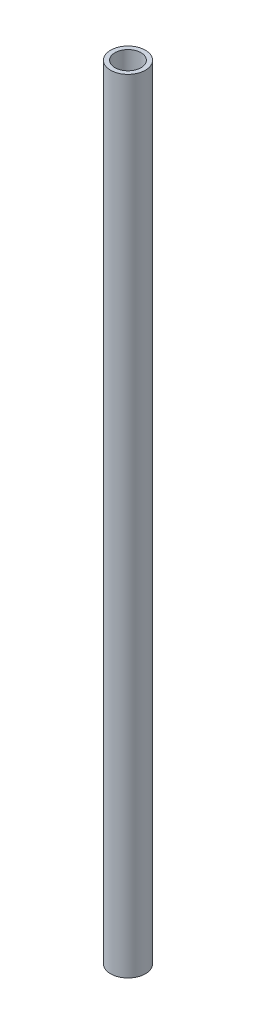
ISO-10303-21;
HEADER;
FILE_DESCRIPTION(('STEP AP214'),'2;1');
FILE_NAME('part.step','',(''),(''),'','','');
FILE_SCHEMA(('AUTOMOTIVE_DESIGN { 1 0 10303 214 1 1 1 1 }'));
ENDSEC;
DATA;
#1=APPLICATION_CONTEXT('core data for automotive mechanical design processes');
#2=APPLICATION_PROTOCOL_DEFINITION('international standard','automotive_design',2000,#1);
#3=PRODUCT_CONTEXT('',#1,'mechanical');
#4=PRODUCT('Part','Part','',(#3));
#5=PRODUCT_RELATED_PRODUCT_CATEGORY('part','',(#4));
#6=PRODUCT_DEFINITION_FORMATION('','',#4);
#7=PRODUCT_DEFINITION_CONTEXT('part definition',#1,'design');
#8=PRODUCT_DEFINITION('design','',#6,#7);
#9=PRODUCT_DEFINITION_SHAPE('','',#8);
#10=(LENGTH_UNIT() NAMED_UNIT(*) SI_UNIT(.MILLI.,.METRE.));
#11=(NAMED_UNIT(*) PLANE_ANGLE_UNIT() SI_UNIT($,.RADIAN.));
#12=(NAMED_UNIT(*) SI_UNIT($,.STERADIAN.) SOLID_ANGLE_UNIT());
#13=UNCERTAINTY_MEASURE_WITH_UNIT(LENGTH_MEASURE(1.E-05),#10,'distance_accuracy_value','');
#14=(GEOMETRIC_REPRESENTATION_CONTEXT(3) GLOBAL_UNCERTAINTY_ASSIGNED_CONTEXT((#13)) GLOBAL_UNIT_ASSIGNED_CONTEXT((#10,
#11,#12)) REPRESENTATION_CONTEXT('',''));
#15=CARTESIAN_POINT('',(0.,0.,0.));
#16=DIRECTION('',(0.,0.,1.));
#17=DIRECTION('',(1.,0.,0.));
#18=AXIS2_PLACEMENT_3D('',#15,#16,#17);
#19=CARTESIAN_POINT('',(0.,0.,0.));
#20=DIRECTION('',(0.,1.,0.));
#21=DIRECTION('',(0.,0.,1.));
#22=AXIS2_PLACEMENT_3D('',#19,#20,#21);
#23=CYLINDRICAL_SURFACE('',#22,4.);
#24=CARTESIAN_POINT('',(0.,180.,0.));
#25=DIRECTION('',(0.,1.,0.));
#26=DIRECTION('',(0.,0.,1.));
#27=AXIS2_PLACEMENT_3D('',#24,#25,#26);
#28=CIRCLE('',#27,4.);
#29=CARTESIAN_POINT('',(0.,180.,4.));
#30=VERTEX_POINT('',#29);
#31=EDGE_CURVE('E60',#30,#30,#28,.T.);
#32=ORIENTED_EDGE('',*,*,#31,.F.);
#33=EDGE_LOOP('',(#32));
#34=FACE_BOUND('',#33,.T.);
#35=CARTESIAN_POINT('',(0.,0.,0.));
#36=DIRECTION('',(0.,1.,0.));
#37=DIRECTION('',(0.,0.,1.));
#38=AXIS2_PLACEMENT_3D('',#35,#36,#37);
#39=CIRCLE('',#38,4.);
#40=CARTESIAN_POINT('',(0.,0.,4.));
#41=VERTEX_POINT('',#40);
#42=EDGE_CURVE('E45',#41,#41,#39,.T.);
#43=ORIENTED_EDGE('',*,*,#42,.T.);
#44=EDGE_LOOP('',(#43));
#45=FACE_BOUND('',#44,.T.);
#46=ADVANCED_FACE('F42',(#34,#45),#23,.T.);
#47=CARTESIAN_POINT('',(0.,0.,0.));
#48=DIRECTION('',(0.,1.,0.));
#49=DIRECTION('',(0.,0.,1.));
#50=AXIS2_PLACEMENT_3D('',#47,#48,#49);
#51=PLANE('',#50);
#52=CARTESIAN_POINT('',(0.,0.,0.));
#53=DIRECTION('',(0.,1.,0.));
#54=DIRECTION('',(0.,0.,1.));
#55=AXIS2_PLACEMENT_3D('',#52,#53,#54);
#56=CIRCLE('',#55,3.);
#57=CARTESIAN_POINT('',(0.,0.,3.));
#58=VERTEX_POINT('',#57);
#59=EDGE_CURVE('E50',#58,#58,#56,.F.);
#60=ORIENTED_EDGE('',*,*,#59,.F.);
#61=EDGE_LOOP('',(#60));
#62=FACE_BOUND('',#61,.T.);
#63=ORIENTED_EDGE('',*,*,#42,.F.);
#64=EDGE_LOOP('',(#63));
#65=FACE_BOUND('',#64,.T.);
#66=ADVANCED_FACE('F78',(#62,#65),#51,.F.);
#67=CARTESIAN_POINT('',(0.,180.,0.));
#68=DIRECTION('',(0.,1.,0.));
#69=DIRECTION('',(0.,0.,1.));
#70=AXIS2_PLACEMENT_3D('',#67,#68,#69);
#71=PLANE('',#70);
#72=CARTESIAN_POINT('',(0.,180.,0.));
#73=DIRECTION('',(0.,1.,0.));
#74=DIRECTION('',(0.,0.,1.));
#75=AXIS2_PLACEMENT_3D('',#72,#73,#74);
#76=CIRCLE('',#75,3.);
#77=CARTESIAN_POINT('',(0.,180.,3.));
#78=VERTEX_POINT('',#77);
#79=EDGE_CURVE('E13',#78,#78,#76,.F.);
#80=ORIENTED_EDGE('',*,*,#79,.T.);
#81=EDGE_LOOP('',(#80));
#82=FACE_BOUND('',#81,.T.);
#83=ORIENTED_EDGE('',*,*,#31,.T.);
#84=EDGE_LOOP('',(#83));
#85=FACE_BOUND('',#84,.T.);
#86=ADVANCED_FACE('F67',(#82,#85),#71,.T.);
#87=CARTESIAN_POINT('',(0.,0.,0.));
#88=DIRECTION('',(0.,1.,0.));
#89=DIRECTION('',(0.,0.,1.));
#90=AXIS2_PLACEMENT_3D('',#87,#88,#89);
#91=CYLINDRICAL_SURFACE('',#90,3.);
#92=ORIENTED_EDGE('',*,*,#79,.F.);
#93=EDGE_LOOP('',(#92));
#94=FACE_BOUND('',#93,.T.);
#95=ORIENTED_EDGE('',*,*,#59,.T.);
#96=EDGE_LOOP('',(#95));
#97=FACE_BOUND('',#96,.T.);
#98=ADVANCED_FACE('F70',(#94,#97),#91,.F.);
#99=CLOSED_SHELL('',(#46,#66,#86,#98));
#100=MANIFOLD_SOLID_BREP('B2',#99);
#101=ADVANCED_BREP_SHAPE_REPRESENTATION('',(#18,#100),#14);
#102=SHAPE_DEFINITION_REPRESENTATION(#9,#101);
ENDSEC;
END-ISO-10303-21;
